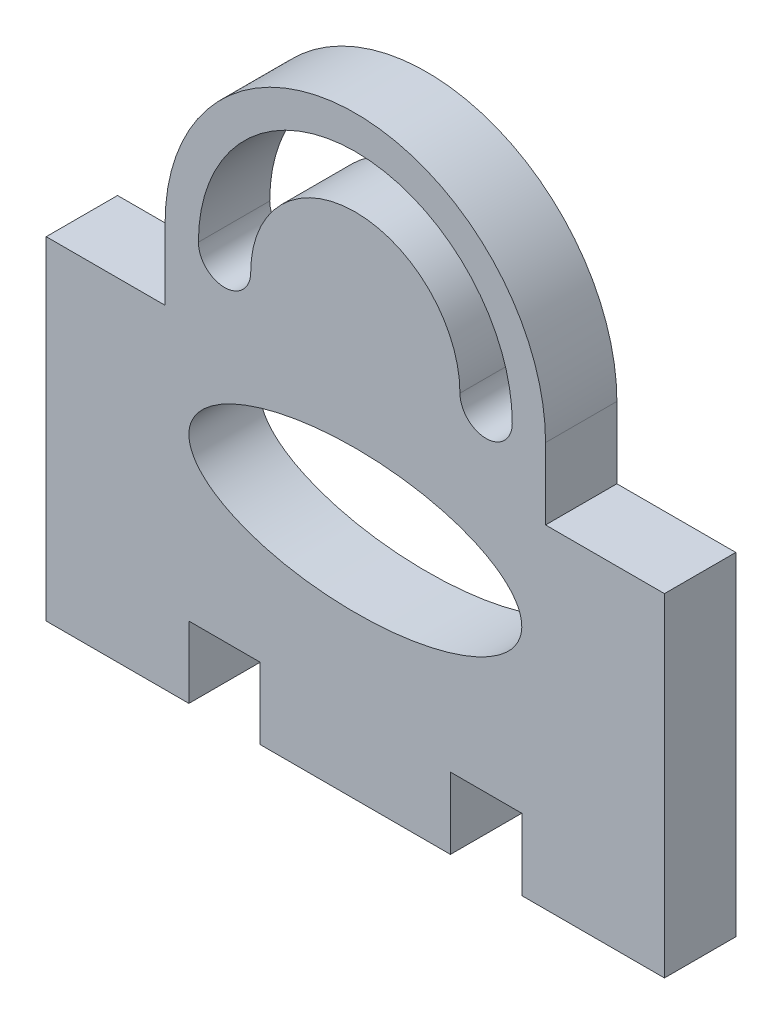
ISO-10303-21;
HEADER;
FILE_DESCRIPTION(('STEP AP214'),'2;1');
FILE_NAME('part.step','',(''),(''),'','','');
FILE_SCHEMA(('AUTOMOTIVE_DESIGN { 1 0 10303 214 1 1 1 1 }'));
ENDSEC;
DATA;
#1=APPLICATION_CONTEXT('core data for automotive mechanical design processes');
#2=APPLICATION_PROTOCOL_DEFINITION('international standard','automotive_design',2000,#1);
#3=PRODUCT_CONTEXT('',#1,'mechanical');
#4=PRODUCT('Part','Part','',(#3));
#5=PRODUCT_RELATED_PRODUCT_CATEGORY('part','',(#4));
#6=PRODUCT_DEFINITION_FORMATION('','',#4);
#7=PRODUCT_DEFINITION_CONTEXT('part definition',#1,'design');
#8=PRODUCT_DEFINITION('design','',#6,#7);
#9=PRODUCT_DEFINITION_SHAPE('','',#8);
#10=(LENGTH_UNIT() NAMED_UNIT(*) SI_UNIT(.MILLI.,.METRE.));
#11=(NAMED_UNIT(*) PLANE_ANGLE_UNIT() SI_UNIT($,.RADIAN.));
#12=(NAMED_UNIT(*) SI_UNIT($,.STERADIAN.) SOLID_ANGLE_UNIT());
#13=UNCERTAINTY_MEASURE_WITH_UNIT(LENGTH_MEASURE(1.E-05),#10,'distance_accuracy_value','');
#14=(GEOMETRIC_REPRESENTATION_CONTEXT(3) GLOBAL_UNCERTAINTY_ASSIGNED_CONTEXT((#13)) GLOBAL_UNIT_ASSIGNED_CONTEXT((#10,
#11,#12)) REPRESENTATION_CONTEXT('',''));
#15=CARTESIAN_POINT('',(0.,0.,0.));
#16=DIRECTION('',(0.,0.,1.));
#17=DIRECTION('',(1.,0.,0.));
#18=AXIS2_PLACEMENT_3D('',#15,#16,#17);
#19=CARTESIAN_POINT('',(0.,100.,30.));
#20=DIRECTION('',(0.,0.,1.));
#21=DIRECTION('',(1.,0.,0.));
#22=AXIS2_PLACEMENT_3D('',#19,#20,#21);
#23=PLANE('',#22);
#24=CARTESIAN_POINT('',(0.,100.,30.));
#25=DIRECTION('',(0.,0.,1.));
#26=DIRECTION('',(1.,0.,0.));
#27=AXIS2_PLACEMENT_3D('',#24,#25,#26);
#28=CIRCLE('',#27,66.);
#29=CARTESIAN_POINT('',(66.,100.,30.));
#30=VERTEX_POINT('',#29);
#31=CARTESIAN_POINT('',(-66.,100.,30.));
#32=VERTEX_POINT('',#31);
#33=EDGE_CURVE('E178',#30,#32,#28,.T.);
#34=ORIENTED_EDGE('',*,*,#33,.F.);
#35=CARTESIAN_POINT('',(55.,100.,30.));
#36=DIRECTION('',(0.,0.,1.));
#37=DIRECTION('',(1.,0.,0.));
#38=AXIS2_PLACEMENT_3D('',#35,#36,#37);
#39=CIRCLE('',#38,11.);
#40=CARTESIAN_POINT('',(44.,100.,30.));
#41=VERTEX_POINT('',#40);
#42=EDGE_CURVE('E170',#41,#30,#39,.T.);
#43=ORIENTED_EDGE('',*,*,#42,.F.);
#44=CARTESIAN_POINT('',(0.,100.,30.));
#45=DIRECTION('',(0.,0.,-1.));
#46=DIRECTION('',(1.,0.,0.));
#47=AXIS2_PLACEMENT_3D('',#44,#45,#46);
#48=CIRCLE('',#47,44.);
#49=CARTESIAN_POINT('',(-44.,100.,30.));
#50=VERTEX_POINT('',#49);
#51=EDGE_CURVE('E193',#50,#41,#48,.T.);
#52=ORIENTED_EDGE('',*,*,#51,.F.);
#53=CARTESIAN_POINT('',(-55.,100.,30.));
#54=DIRECTION('',(0.,0.,1.));
#55=DIRECTION('',(1.,0.,0.));
#56=AXIS2_PLACEMENT_3D('',#53,#54,#55);
#57=CIRCLE('',#56,11.);
#58=EDGE_CURVE('E191',#32,#50,#57,.T.);
#59=ORIENTED_EDGE('',*,*,#58,.F.);
#60=EDGE_LOOP('',(#34,#43,#52,#59));
#61=FACE_BOUND('',#60,.T.);
#62=DIRECTION('',(-1.,0.,0.));
#63=VECTOR('',#62,1.);
#64=CARTESIAN_POINT('',(-80.,70.,30.));
#65=LINE('',#64,#63);
#66=CARTESIAN_POINT('',(-80.,70.,30.));
#67=VERTEX_POINT('',#66);
#68=CARTESIAN_POINT('',(-130.,70.,30.));
#69=VERTEX_POINT('',#68);
#70=EDGE_CURVE('E209',#67,#69,#65,.T.);
#71=ORIENTED_EDGE('',*,*,#70,.T.);
#72=DIRECTION('',(0.,-1.,0.));
#73=VECTOR('',#72,1.);
#74=CARTESIAN_POINT('',(-130.,-70.,30.));
#75=LINE('',#74,#73);
#76=CARTESIAN_POINT('',(-130.,-70.,30.));
#77=VERTEX_POINT('',#76);
#78=EDGE_CURVE('E212',#69,#77,#75,.T.);
#79=ORIENTED_EDGE('',*,*,#78,.T.);
#80=DIRECTION('',(1.,0.,0.));
#81=VECTOR('',#80,1.);
#82=CARTESIAN_POINT('',(-130.,-70.,30.));
#83=LINE('',#82,#81);
#84=CARTESIAN_POINT('',(-70.,-70.,30.));
#85=VERTEX_POINT('',#84);
#86=EDGE_CURVE('E215',#77,#85,#83,.T.);
#87=ORIENTED_EDGE('',*,*,#86,.T.);
#88=DIRECTION('',(0.,1.,0.));
#89=VECTOR('',#88,1.);
#90=CARTESIAN_POINT('',(-70.,-70.,30.));
#91=LINE('',#90,#89);
#92=CARTESIAN_POINT('',(-70.,-40.,30.));
#93=VERTEX_POINT('',#92);
#94=EDGE_CURVE('E217',#85,#93,#91,.T.);
#95=ORIENTED_EDGE('',*,*,#94,.T.);
#96=DIRECTION('',(1.,0.,0.));
#97=VECTOR('',#96,1.);
#98=CARTESIAN_POINT('',(-40.,-40.,30.));
#99=LINE('',#98,#97);
#100=CARTESIAN_POINT('',(-40.,-40.,30.));
#101=VERTEX_POINT('',#100);
#102=EDGE_CURVE('E219',#93,#101,#99,.T.);
#103=ORIENTED_EDGE('',*,*,#102,.T.);
#104=DIRECTION('',(0.,-1.,0.));
#105=VECTOR('',#104,1.);
#106=CARTESIAN_POINT('',(-40.,-70.,30.));
#107=LINE('',#106,#105);
#108=CARTESIAN_POINT('',(-40.,-70.,30.));
#109=VERTEX_POINT('',#108);
#110=EDGE_CURVE('E221',#101,#109,#107,.T.);
#111=ORIENTED_EDGE('',*,*,#110,.T.);
#112=DIRECTION('',(1.,0.,0.));
#113=VECTOR('',#112,1.);
#114=CARTESIAN_POINT('',(40.,-70.,30.));
#115=LINE('',#114,#113);
#116=CARTESIAN_POINT('',(40.,-70.,30.));
#117=VERTEX_POINT('',#116);
#118=EDGE_CURVE('E223',#109,#117,#115,.T.);
#119=ORIENTED_EDGE('',*,*,#118,.T.);
#120=DIRECTION('',(0.,1.,0.));
#121=VECTOR('',#120,1.);
#122=CARTESIAN_POINT('',(40.,-40.,30.));
#123=LINE('',#122,#121);
#124=CARTESIAN_POINT('',(40.,-40.,30.));
#125=VERTEX_POINT('',#124);
#126=EDGE_CURVE('E225',#117,#125,#123,.T.);
#127=ORIENTED_EDGE('',*,*,#126,.T.);
#128=DIRECTION('',(1.,0.,0.));
#129=VECTOR('',#128,1.);
#130=CARTESIAN_POINT('',(70.,-40.,30.));
#131=LINE('',#130,#129);
#132=CARTESIAN_POINT('',(70.,-40.,30.));
#133=VERTEX_POINT('',#132);
#134=EDGE_CURVE('E227',#125,#133,#131,.T.);
#135=ORIENTED_EDGE('',*,*,#134,.T.);
#136=DIRECTION('',(0.,-1.,0.));
#137=VECTOR('',#136,1.);
#138=CARTESIAN_POINT('',(70.,-40.,30.));
#139=LINE('',#138,#137);
#140=CARTESIAN_POINT('',(70.,-70.,30.));
#141=VERTEX_POINT('',#140);
#142=EDGE_CURVE('E229',#133,#141,#139,.T.);
#143=ORIENTED_EDGE('',*,*,#142,.T.);
#144=DIRECTION('',(1.,0.,0.));
#145=VECTOR('',#144,1.);
#146=CARTESIAN_POINT('',(130.,-70.,30.));
#147=LINE('',#146,#145);
#148=CARTESIAN_POINT('',(130.,-70.,30.));
#149=VERTEX_POINT('',#148);
#150=EDGE_CURVE('E231',#141,#149,#147,.T.);
#151=ORIENTED_EDGE('',*,*,#150,.T.);
#152=DIRECTION('',(0.,1.,0.));
#153=VECTOR('',#152,1.);
#154=CARTESIAN_POINT('',(130.,-70.,30.));
#155=LINE('',#154,#153);
#156=CARTESIAN_POINT('',(130.,70.,30.));
#157=VERTEX_POINT('',#156);
#158=EDGE_CURVE('E233',#149,#157,#155,.T.);
#159=ORIENTED_EDGE('',*,*,#158,.T.);
#160=DIRECTION('',(-1.,0.,0.));
#161=VECTOR('',#160,1.);
#162=CARTESIAN_POINT('',(130.,70.,30.));
#163=LINE('',#162,#161);
#164=CARTESIAN_POINT('',(80.,70.,30.));
#165=VERTEX_POINT('',#164);
#166=EDGE_CURVE('E235',#157,#165,#163,.T.);
#167=ORIENTED_EDGE('',*,*,#166,.T.);
#168=DIRECTION('',(0.,1.,0.));
#169=VECTOR('',#168,1.);
#170=CARTESIAN_POINT('',(80.,100.,30.));
#171=LINE('',#170,#169);
#172=CARTESIAN_POINT('',(80.,100.,30.));
#173=VERTEX_POINT('',#172);
#174=EDGE_CURVE('E237',#165,#173,#171,.T.);
#175=ORIENTED_EDGE('',*,*,#174,.T.);
#176=CARTESIAN_POINT('',(0.,100.,30.));
#177=DIRECTION('',(0.,0.,1.));
#178=DIRECTION('',(1.,0.,0.));
#179=AXIS2_PLACEMENT_3D('',#176,#177,#178);
#180=CIRCLE('',#179,80.);
#181=CARTESIAN_POINT('',(-80.,100.,30.));
#182=VERTEX_POINT('',#181);
#183=EDGE_CURVE('E239',#173,#182,#180,.T.);
#184=ORIENTED_EDGE('',*,*,#183,.T.);
#185=DIRECTION('',(0.,-1.,0.));
#186=VECTOR('',#185,1.);
#187=CARTESIAN_POINT('',(-80.,100.,30.));
#188=LINE('',#187,#186);
#189=EDGE_CURVE('E241',#182,#67,#188,.T.);
#190=ORIENTED_EDGE('',*,*,#189,.T.);
#191=EDGE_LOOP('',(#71,#79,#87,#95,#103,#111,#119,#127,#135,#143,#151,#159,#167,#175,#184,#190));
#192=FACE_BOUND('',#191,.T.);
#193=CARTESIAN_POINT('',(0.,28.0052739258551,30.));
#194=DIRECTION('',(0.,0.,1.));
#195=DIRECTION('',(-1.,0.,0.));
#196=AXIS2_PLACEMENT_3D('',#193,#194,#195);
#197=ELLIPSE('',#196,70.,30.);
#198=CARTESIAN_POINT('',(-70.,28.0052739258551,30.));
#199=VERTEX_POINT('',#198);
#200=EDGE_CURVE('E199',#199,#199,#197,.T.);
#201=ORIENTED_EDGE('',*,*,#200,.F.);
#202=EDGE_LOOP('',(#201));
#203=FACE_BOUND('',#202,.T.);
#204=ADVANCED_FACE('F33',(#61,#192,#203),#23,.T.);
#205=CARTESIAN_POINT('',(0.,100.,0.));
#206=DIRECTION('',(0.,0.,1.));
#207=DIRECTION('',(1.,0.,0.));
#208=AXIS2_PLACEMENT_3D('',#205,#206,#207);
#209=PLANE('',#208);
#210=DIRECTION('',(-1.,0.,0.));
#211=VECTOR('',#210,1.);
#212=CARTESIAN_POINT('',(-80.,70.,0.));
#213=LINE('',#212,#211);
#214=CARTESIAN_POINT('',(-80.,70.,0.));
#215=VERTEX_POINT('',#214);
#216=CARTESIAN_POINT('',(-130.,70.,0.));
#217=VERTEX_POINT('',#216);
#218=EDGE_CURVE('E186',#215,#217,#213,.T.);
#219=ORIENTED_EDGE('',*,*,#218,.F.);
#220=DIRECTION('',(0.,-1.,0.));
#221=VECTOR('',#220,1.);
#222=CARTESIAN_POINT('',(-80.,100.,0.));
#223=LINE('',#222,#221);
#224=CARTESIAN_POINT('',(-80.,100.,0.));
#225=VERTEX_POINT('',#224);
#226=EDGE_CURVE('E213',#225,#215,#223,.T.);
#227=ORIENTED_EDGE('',*,*,#226,.F.);
#228=CARTESIAN_POINT('',(0.,100.,0.));
#229=DIRECTION('',(0.,0.,1.));
#230=DIRECTION('',(1.,0.,0.));
#231=AXIS2_PLACEMENT_3D('',#228,#229,#230);
#232=CIRCLE('',#231,80.);
#233=CARTESIAN_POINT('',(80.,100.,0.));
#234=VERTEX_POINT('',#233);
#235=EDGE_CURVE('E272',#234,#225,#232,.T.);
#236=ORIENTED_EDGE('',*,*,#235,.F.);
#237=DIRECTION('',(0.,1.,0.));
#238=VECTOR('',#237,1.);
#239=CARTESIAN_POINT('',(80.,100.,0.));
#240=LINE('',#239,#238);
#241=CARTESIAN_POINT('',(80.,70.,0.));
#242=VERTEX_POINT('',#241);
#243=EDGE_CURVE('E270',#242,#234,#240,.T.);
#244=ORIENTED_EDGE('',*,*,#243,.F.);
#245=DIRECTION('',(-1.,0.,0.));
#246=VECTOR('',#245,1.);
#247=CARTESIAN_POINT('',(130.,70.,0.));
#248=LINE('',#247,#246);
#249=CARTESIAN_POINT('',(130.,70.,0.));
#250=VERTEX_POINT('',#249);
#251=EDGE_CURVE('E268',#250,#242,#248,.T.);
#252=ORIENTED_EDGE('',*,*,#251,.F.);
#253=DIRECTION('',(0.,1.,0.));
#254=VECTOR('',#253,1.);
#255=CARTESIAN_POINT('',(130.,-70.,0.));
#256=LINE('',#255,#254);
#257=CARTESIAN_POINT('',(130.,-70.,0.));
#258=VERTEX_POINT('',#257);
#259=EDGE_CURVE('E266',#258,#250,#256,.T.);
#260=ORIENTED_EDGE('',*,*,#259,.F.);
#261=DIRECTION('',(1.,0.,0.));
#262=VECTOR('',#261,1.);
#263=CARTESIAN_POINT('',(130.,-70.,0.));
#264=LINE('',#263,#262);
#265=CARTESIAN_POINT('',(70.,-70.,0.));
#266=VERTEX_POINT('',#265);
#267=EDGE_CURVE('E264',#266,#258,#264,.T.);
#268=ORIENTED_EDGE('',*,*,#267,.F.);
#269=DIRECTION('',(0.,-1.,0.));
#270=VECTOR('',#269,1.);
#271=CARTESIAN_POINT('',(70.,-40.,0.));
#272=LINE('',#271,#270);
#273=CARTESIAN_POINT('',(70.,-40.,0.));
#274=VERTEX_POINT('',#273);
#275=EDGE_CURVE('E262',#274,#266,#272,.T.);
#276=ORIENTED_EDGE('',*,*,#275,.F.);
#277=DIRECTION('',(1.,0.,0.));
#278=VECTOR('',#277,1.);
#279=CARTESIAN_POINT('',(70.,-40.,0.));
#280=LINE('',#279,#278);
#281=CARTESIAN_POINT('',(40.,-40.,0.));
#282=VERTEX_POINT('',#281);
#283=EDGE_CURVE('E260',#282,#274,#280,.T.);
#284=ORIENTED_EDGE('',*,*,#283,.F.);
#285=DIRECTION('',(0.,1.,0.));
#286=VECTOR('',#285,1.);
#287=CARTESIAN_POINT('',(40.,-40.,0.));
#288=LINE('',#287,#286);
#289=CARTESIAN_POINT('',(40.,-70.,0.));
#290=VERTEX_POINT('',#289);
#291=EDGE_CURVE('E258',#290,#282,#288,.T.);
#292=ORIENTED_EDGE('',*,*,#291,.F.);
#293=DIRECTION('',(1.,0.,0.));
#294=VECTOR('',#293,1.);
#295=CARTESIAN_POINT('',(40.,-70.,0.));
#296=LINE('',#295,#294);
#297=CARTESIAN_POINT('',(-40.,-70.,0.));
#298=VERTEX_POINT('',#297);
#299=EDGE_CURVE('E256',#298,#290,#296,.T.);
#300=ORIENTED_EDGE('',*,*,#299,.F.);
#301=DIRECTION('',(0.,-1.,0.));
#302=VECTOR('',#301,1.);
#303=CARTESIAN_POINT('',(-40.,-70.,0.));
#304=LINE('',#303,#302);
#305=CARTESIAN_POINT('',(-40.,-40.,0.));
#306=VERTEX_POINT('',#305);
#307=EDGE_CURVE('E254',#306,#298,#304,.T.);
#308=ORIENTED_EDGE('',*,*,#307,.F.);
#309=DIRECTION('',(1.,0.,0.));
#310=VECTOR('',#309,1.);
#311=CARTESIAN_POINT('',(-40.,-40.,0.));
#312=LINE('',#311,#310);
#313=CARTESIAN_POINT('',(-70.,-40.,0.));
#314=VERTEX_POINT('',#313);
#315=EDGE_CURVE('E252',#314,#306,#312,.T.);
#316=ORIENTED_EDGE('',*,*,#315,.F.);
#317=DIRECTION('',(0.,1.,0.));
#318=VECTOR('',#317,1.);
#319=CARTESIAN_POINT('',(-70.,-70.,0.));
#320=LINE('',#319,#318);
#321=CARTESIAN_POINT('',(-70.,-70.,0.));
#322=VERTEX_POINT('',#321);
#323=EDGE_CURVE('E250',#322,#314,#320,.T.);
#324=ORIENTED_EDGE('',*,*,#323,.F.);
#325=DIRECTION('',(1.,0.,0.));
#326=VECTOR('',#325,1.);
#327=CARTESIAN_POINT('',(-130.,-70.,0.));
#328=LINE('',#327,#326);
#329=CARTESIAN_POINT('',(-130.,-70.,0.));
#330=VERTEX_POINT('',#329);
#331=EDGE_CURVE('E248',#330,#322,#328,.T.);
#332=ORIENTED_EDGE('',*,*,#331,.F.);
#333=DIRECTION('',(0.,-1.,0.));
#334=VECTOR('',#333,1.);
#335=CARTESIAN_POINT('',(-130.,-70.,0.));
#336=LINE('',#335,#334);
#337=EDGE_CURVE('E246',#217,#330,#336,.T.);
#338=ORIENTED_EDGE('',*,*,#337,.F.);
#339=EDGE_LOOP('',(#219,#227,#236,#244,#252,#260,#268,#276,#284,#292,#300,#308,#316,#324,#332,#338));
#340=FACE_BOUND('',#339,.T.);
#341=CARTESIAN_POINT('',(55.,100.,0.));
#342=DIRECTION('',(0.,0.,1.));
#343=DIRECTION('',(1.,0.,0.));
#344=AXIS2_PLACEMENT_3D('',#341,#342,#343);
#345=CIRCLE('',#344,11.);
#346=CARTESIAN_POINT('',(44.,100.,0.));
#347=VERTEX_POINT('',#346);
#348=CARTESIAN_POINT('',(66.,100.,0.));
#349=VERTEX_POINT('',#348);
#350=EDGE_CURVE('E56',#347,#349,#345,.T.);
#351=ORIENTED_EDGE('',*,*,#350,.T.);
#352=CARTESIAN_POINT('',(0.,100.,0.));
#353=DIRECTION('',(0.,0.,1.));
#354=DIRECTION('',(1.,0.,0.));
#355=AXIS2_PLACEMENT_3D('',#352,#353,#354);
#356=CIRCLE('',#355,66.);
#357=CARTESIAN_POINT('',(-66.,100.,0.));
#358=VERTEX_POINT('',#357);
#359=EDGE_CURVE('E185',#349,#358,#356,.T.);
#360=ORIENTED_EDGE('',*,*,#359,.T.);
#361=CARTESIAN_POINT('',(-55.,100.,0.));
#362=DIRECTION('',(0.,0.,1.));
#363=DIRECTION('',(1.,0.,0.));
#364=AXIS2_PLACEMENT_3D('',#361,#362,#363);
#365=CIRCLE('',#364,11.);
#366=CARTESIAN_POINT('',(-44.,100.,0.));
#367=VERTEX_POINT('',#366);
#368=EDGE_CURVE('E201',#358,#367,#365,.T.);
#369=ORIENTED_EDGE('',*,*,#368,.T.);
#370=CARTESIAN_POINT('',(0.,100.,0.));
#371=DIRECTION('',(0.,0.,-1.));
#372=DIRECTION('',(1.,0.,0.));
#373=AXIS2_PLACEMENT_3D('',#370,#371,#372);
#374=CIRCLE('',#373,44.);
#375=EDGE_CURVE('E179',#367,#347,#374,.T.);
#376=ORIENTED_EDGE('',*,*,#375,.T.);
#377=EDGE_LOOP('',(#351,#360,#369,#376));
#378=FACE_BOUND('',#377,.T.);
#379=CARTESIAN_POINT('',(0.,28.0052739258551,0.));
#380=DIRECTION('',(0.,0.,1.));
#381=DIRECTION('',(-1.,0.,0.));
#382=AXIS2_PLACEMENT_3D('',#379,#380,#381);
#383=ELLIPSE('',#382,70.,30.);
#384=CARTESIAN_POINT('',(-70.,28.0052739258551,0.));
#385=VERTEX_POINT('',#384);
#386=EDGE_CURVE('E588',#385,#385,#383,.T.);
#387=ORIENTED_EDGE('',*,*,#386,.T.);
#388=EDGE_LOOP('',(#387));
#389=FACE_BOUND('',#388,.T.);
#390=ADVANCED_FACE('F326',(#340,#378,#389),#209,.F.);
#391=CARTESIAN_POINT('',(-80.,70.,30.));
#392=DIRECTION('',(0.,-1.,0.));
#393=DIRECTION('',(1.,0.,0.));
#394=AXIS2_PLACEMENT_3D('',#391,#392,#393);
#395=PLANE('',#394);
#396=ORIENTED_EDGE('',*,*,#218,.T.);
#397=DIRECTION('',(0.,0.,-1.));
#398=VECTOR('',#397,1.);
#399=CARTESIAN_POINT('',(-130.,70.,30.));
#400=LINE('',#399,#398);
#401=EDGE_CURVE('E11',#69,#217,#400,.T.);
#402=ORIENTED_EDGE('',*,*,#401,.F.);
#403=ORIENTED_EDGE('',*,*,#70,.F.);
#404=DIRECTION('',(0.,0.,-1.));
#405=VECTOR('',#404,1.);
#406=CARTESIAN_POINT('',(-80.,70.,30.));
#407=LINE('',#406,#405);
#408=EDGE_CURVE('E243',#67,#215,#407,.T.);
#409=ORIENTED_EDGE('',*,*,#408,.T.);
#410=EDGE_LOOP('',(#396,#402,#403,#409));
#411=FACE_BOUND('',#410,.T.);
#412=ADVANCED_FACE('F35',(#411),#395,.F.);
#413=CARTESIAN_POINT('',(-130.,-70.,30.));
#414=DIRECTION('',(1.,0.,0.));
#415=DIRECTION('',(0.,0.,-1.));
#416=AXIS2_PLACEMENT_3D('',#413,#414,#415);
#417=PLANE('',#416);
#418=ORIENTED_EDGE('',*,*,#337,.T.);
#419=DIRECTION('',(0.,0.,-1.));
#420=VECTOR('',#419,1.);
#421=CARTESIAN_POINT('',(-130.,-70.,30.));
#422=LINE('',#421,#420);
#423=EDGE_CURVE('E41',#77,#330,#422,.T.);
#424=ORIENTED_EDGE('',*,*,#423,.F.);
#425=ORIENTED_EDGE('',*,*,#78,.F.);
#426=ORIENTED_EDGE('',*,*,#401,.T.);
#427=EDGE_LOOP('',(#418,#424,#425,#426));
#428=FACE_BOUND('',#427,.T.);
#429=ADVANCED_FACE('F343',(#428),#417,.F.);
#430=CARTESIAN_POINT('',(-130.,-70.,30.));
#431=DIRECTION('',(0.,1.,0.));
#432=DIRECTION('',(-1.,0.,0.));
#433=AXIS2_PLACEMENT_3D('',#430,#431,#432);
#434=PLANE('',#433);
#435=ORIENTED_EDGE('',*,*,#331,.T.);
#436=DIRECTION('',(0.,0.,-1.));
#437=VECTOR('',#436,1.);
#438=CARTESIAN_POINT('',(-70.,-70.,30.));
#439=LINE('',#438,#437);
#440=EDGE_CURVE('E313',#85,#322,#439,.T.);
#441=ORIENTED_EDGE('',*,*,#440,.F.);
#442=ORIENTED_EDGE('',*,*,#86,.F.);
#443=ORIENTED_EDGE('',*,*,#423,.T.);
#444=EDGE_LOOP('',(#435,#441,#442,#443));
#445=FACE_BOUND('',#444,.T.);
#446=ADVANCED_FACE('F320',(#445),#434,.F.);
#447=CARTESIAN_POINT('',(-70.,-70.,30.));
#448=DIRECTION('',(-1.,0.,0.));
#449=DIRECTION('',(0.,0.,1.));
#450=AXIS2_PLACEMENT_3D('',#447,#448,#449);
#451=PLANE('',#450);
#452=ORIENTED_EDGE('',*,*,#323,.T.);
#453=DIRECTION('',(0.,0.,-1.));
#454=VECTOR('',#453,1.);
#455=CARTESIAN_POINT('',(-70.,-40.,30.));
#456=LINE('',#455,#454);
#457=EDGE_CURVE('E310',#93,#314,#456,.T.);
#458=ORIENTED_EDGE('',*,*,#457,.F.);
#459=ORIENTED_EDGE('',*,*,#94,.F.);
#460=ORIENTED_EDGE('',*,*,#440,.T.);
#461=EDGE_LOOP('',(#452,#458,#459,#460));
#462=FACE_BOUND('',#461,.T.);
#463=ADVANCED_FACE('F332',(#462),#451,.F.);
#464=CARTESIAN_POINT('',(-40.,-40.,30.));
#465=DIRECTION('',(0.,1.,0.));
#466=DIRECTION('',(0.,0.,1.));
#467=AXIS2_PLACEMENT_3D('',#464,#465,#466);
#468=PLANE('',#467);
#469=ORIENTED_EDGE('',*,*,#315,.T.);
#470=DIRECTION('',(0.,0.,-1.));
#471=VECTOR('',#470,1.);
#472=CARTESIAN_POINT('',(-40.,-40.,30.));
#473=LINE('',#472,#471);
#474=EDGE_CURVE('E307',#101,#306,#473,.T.);
#475=ORIENTED_EDGE('',*,*,#474,.F.);
#476=ORIENTED_EDGE('',*,*,#102,.F.);
#477=ORIENTED_EDGE('',*,*,#457,.T.);
#478=EDGE_LOOP('',(#469,#475,#476,#477));
#479=FACE_BOUND('',#478,.T.);
#480=ADVANCED_FACE('F336',(#479),#468,.F.);
#481=CARTESIAN_POINT('',(-40.,-70.,30.));
#482=DIRECTION('',(1.,0.,0.));
#483=DIRECTION('',(0.,0.,-1.));
#484=AXIS2_PLACEMENT_3D('',#481,#482,#483);
#485=PLANE('',#484);
#486=ORIENTED_EDGE('',*,*,#307,.T.);
#487=DIRECTION('',(0.,0.,-1.));
#488=VECTOR('',#487,1.);
#489=CARTESIAN_POINT('',(-40.,-70.,30.));
#490=LINE('',#489,#488);
#491=EDGE_CURVE('E304',#109,#298,#490,.T.);
#492=ORIENTED_EDGE('',*,*,#491,.F.);
#493=ORIENTED_EDGE('',*,*,#110,.F.);
#494=ORIENTED_EDGE('',*,*,#474,.T.);
#495=EDGE_LOOP('',(#486,#492,#493,#494));
#496=FACE_BOUND('',#495,.T.);
#497=ADVANCED_FACE('F396',(#496),#485,.F.);
#498=CARTESIAN_POINT('',(40.,-70.,30.));
#499=DIRECTION('',(0.,1.,0.));
#500=DIRECTION('',(0.,0.,1.));
#501=AXIS2_PLACEMENT_3D('',#498,#499,#500);
#502=PLANE('',#501);
#503=ORIENTED_EDGE('',*,*,#299,.T.);
#504=DIRECTION('',(0.,0.,-1.));
#505=VECTOR('',#504,1.);
#506=CARTESIAN_POINT('',(40.,-70.,30.));
#507=LINE('',#506,#505);
#508=EDGE_CURVE('E301',#117,#290,#507,.T.);
#509=ORIENTED_EDGE('',*,*,#508,.F.);
#510=ORIENTED_EDGE('',*,*,#118,.F.);
#511=ORIENTED_EDGE('',*,*,#491,.T.);
#512=EDGE_LOOP('',(#503,#509,#510,#511));
#513=FACE_BOUND('',#512,.T.);
#514=ADVANCED_FACE('F393',(#513),#502,.F.);
#515=CARTESIAN_POINT('',(40.,-40.,30.));
#516=DIRECTION('',(-1.,0.,0.));
#517=DIRECTION('',(0.,0.,1.));
#518=AXIS2_PLACEMENT_3D('',#515,#516,#517);
#519=PLANE('',#518);
#520=ORIENTED_EDGE('',*,*,#291,.T.);
#521=DIRECTION('',(0.,0.,-1.));
#522=VECTOR('',#521,1.);
#523=CARTESIAN_POINT('',(40.,-40.,30.));
#524=LINE('',#523,#522);
#525=EDGE_CURVE('E298',#125,#282,#524,.T.);
#526=ORIENTED_EDGE('',*,*,#525,.F.);
#527=ORIENTED_EDGE('',*,*,#126,.F.);
#528=ORIENTED_EDGE('',*,*,#508,.T.);
#529=EDGE_LOOP('',(#520,#526,#527,#528));
#530=FACE_BOUND('',#529,.T.);
#531=ADVANCED_FACE('F389',(#530),#519,.F.);
#532=CARTESIAN_POINT('',(70.,-40.,30.));
#533=DIRECTION('',(0.,1.,0.));
#534=DIRECTION('',(0.,0.,1.));
#535=AXIS2_PLACEMENT_3D('',#532,#533,#534);
#536=PLANE('',#535);
#537=ORIENTED_EDGE('',*,*,#283,.T.);
#538=DIRECTION('',(0.,0.,-1.));
#539=VECTOR('',#538,1.);
#540=CARTESIAN_POINT('',(70.,-40.,30.));
#541=LINE('',#540,#539);
#542=EDGE_CURVE('E295',#133,#274,#541,.T.);
#543=ORIENTED_EDGE('',*,*,#542,.F.);
#544=ORIENTED_EDGE('',*,*,#134,.F.);
#545=ORIENTED_EDGE('',*,*,#525,.T.);
#546=EDGE_LOOP('',(#537,#543,#544,#545));
#547=FACE_BOUND('',#546,.T.);
#548=ADVANCED_FACE('F385',(#547),#536,.F.);
#549=CARTESIAN_POINT('',(70.,-40.,30.));
#550=DIRECTION('',(1.,0.,0.));
#551=DIRECTION('',(0.,0.,-1.));
#552=AXIS2_PLACEMENT_3D('',#549,#550,#551);
#553=PLANE('',#552);
#554=ORIENTED_EDGE('',*,*,#275,.T.);
#555=DIRECTION('',(0.,0.,-1.));
#556=VECTOR('',#555,1.);
#557=CARTESIAN_POINT('',(70.,-70.,30.));
#558=LINE('',#557,#556);
#559=EDGE_CURVE('E292',#141,#266,#558,.T.);
#560=ORIENTED_EDGE('',*,*,#559,.F.);
#561=ORIENTED_EDGE('',*,*,#142,.F.);
#562=ORIENTED_EDGE('',*,*,#542,.T.);
#563=EDGE_LOOP('',(#554,#560,#561,#562));
#564=FACE_BOUND('',#563,.T.);
#565=ADVANCED_FACE('F380',(#564),#553,.F.);
#566=CARTESIAN_POINT('',(130.,-70.,30.));
#567=DIRECTION('',(0.,1.,0.));
#568=DIRECTION('',(-1.,0.,0.));
#569=AXIS2_PLACEMENT_3D('',#566,#567,#568);
#570=PLANE('',#569);
#571=ORIENTED_EDGE('',*,*,#267,.T.);
#572=DIRECTION('',(0.,0.,-1.));
#573=VECTOR('',#572,1.);
#574=CARTESIAN_POINT('',(130.,-70.,30.));
#575=LINE('',#574,#573);
#576=EDGE_CURVE('E289',#149,#258,#575,.T.);
#577=ORIENTED_EDGE('',*,*,#576,.F.);
#578=ORIENTED_EDGE('',*,*,#150,.F.);
#579=ORIENTED_EDGE('',*,*,#559,.T.);
#580=EDGE_LOOP('',(#571,#577,#578,#579));
#581=FACE_BOUND('',#580,.T.);
#582=ADVANCED_FACE('F374',(#581),#570,.F.);
#583=CARTESIAN_POINT('',(130.,-70.,30.));
#584=DIRECTION('',(-1.,0.,0.));
#585=DIRECTION('',(0.,0.,1.));
#586=AXIS2_PLACEMENT_3D('',#583,#584,#585);
#587=PLANE('',#586);
#588=ORIENTED_EDGE('',*,*,#259,.T.);
#589=DIRECTION('',(0.,0.,-1.));
#590=VECTOR('',#589,1.);
#591=CARTESIAN_POINT('',(130.,70.,30.));
#592=LINE('',#591,#590);
#593=EDGE_CURVE('E286',#157,#250,#592,.T.);
#594=ORIENTED_EDGE('',*,*,#593,.F.);
#595=ORIENTED_EDGE('',*,*,#158,.F.);
#596=ORIENTED_EDGE('',*,*,#576,.T.);
#597=EDGE_LOOP('',(#588,#594,#595,#596));
#598=FACE_BOUND('',#597,.T.);
#599=ADVANCED_FACE('F370',(#598),#587,.F.);
#600=CARTESIAN_POINT('',(130.,70.,30.));
#601=DIRECTION('',(0.,-1.,0.));
#602=DIRECTION('',(1.,0.,0.));
#603=AXIS2_PLACEMENT_3D('',#600,#601,#602);
#604=PLANE('',#603);
#605=ORIENTED_EDGE('',*,*,#251,.T.);
#606=DIRECTION('',(0.,0.,-1.));
#607=VECTOR('',#606,1.);
#608=CARTESIAN_POINT('',(80.,70.,30.));
#609=LINE('',#608,#607);
#610=EDGE_CURVE('E283',#165,#242,#609,.T.);
#611=ORIENTED_EDGE('',*,*,#610,.F.);
#612=ORIENTED_EDGE('',*,*,#166,.F.);
#613=ORIENTED_EDGE('',*,*,#593,.T.);
#614=EDGE_LOOP('',(#605,#611,#612,#613));
#615=FACE_BOUND('',#614,.T.);
#616=ADVANCED_FACE('F365',(#615),#604,.F.);
#617=CARTESIAN_POINT('',(80.,100.,30.));
#618=DIRECTION('',(-1.,0.,0.));
#619=DIRECTION('',(0.,0.,1.));
#620=AXIS2_PLACEMENT_3D('',#617,#618,#619);
#621=PLANE('',#620);
#622=ORIENTED_EDGE('',*,*,#243,.T.);
#623=DIRECTION('',(0.,0.,-1.));
#624=VECTOR('',#623,1.);
#625=CARTESIAN_POINT('',(80.,100.,30.));
#626=LINE('',#625,#624);
#627=EDGE_CURVE('E280',#173,#234,#626,.T.);
#628=ORIENTED_EDGE('',*,*,#627,.F.);
#629=ORIENTED_EDGE('',*,*,#174,.F.);
#630=ORIENTED_EDGE('',*,*,#610,.T.);
#631=EDGE_LOOP('',(#622,#628,#629,#630));
#632=FACE_BOUND('',#631,.T.);
#633=ADVANCED_FACE('F359',(#632),#621,.F.);
#634=CARTESIAN_POINT('',(0.,100.,30.));
#635=DIRECTION('',(0.,0.,-1.));
#636=DIRECTION('',(-1.,0.,0.));
#637=AXIS2_PLACEMENT_3D('',#634,#635,#636);
#638=CYLINDRICAL_SURFACE('',#637,80.);
#639=ORIENTED_EDGE('',*,*,#235,.T.);
#640=DIRECTION('',(0.,0.,-1.));
#641=VECTOR('',#640,1.);
#642=CARTESIAN_POINT('',(-80.,100.,30.));
#643=LINE('',#642,#641);
#644=EDGE_CURVE('E277',#182,#225,#643,.T.);
#645=ORIENTED_EDGE('',*,*,#644,.F.);
#646=ORIENTED_EDGE('',*,*,#183,.F.);
#647=ORIENTED_EDGE('',*,*,#627,.T.);
#648=EDGE_LOOP('',(#639,#645,#646,#647));
#649=FACE_BOUND('',#648,.T.);
#650=ADVANCED_FACE('F355',(#649),#638,.T.);
#651=CARTESIAN_POINT('',(-80.,100.,30.));
#652=DIRECTION('',(1.,0.,0.));
#653=DIRECTION('',(0.,1.,0.));
#654=AXIS2_PLACEMENT_3D('',#651,#652,#653);
#655=PLANE('',#654);
#656=ORIENTED_EDGE('',*,*,#226,.T.);
#657=ORIENTED_EDGE('',*,*,#408,.F.);
#658=ORIENTED_EDGE('',*,*,#189,.F.);
#659=ORIENTED_EDGE('',*,*,#644,.T.);
#660=EDGE_LOOP('',(#656,#657,#658,#659));
#661=FACE_BOUND('',#660,.T.);
#662=ADVANCED_FACE('F350',(#661),#655,.F.);
#663=CARTESIAN_POINT('',(55.,100.,30.));
#664=DIRECTION('',(0.,0.,-1.));
#665=DIRECTION('',(-1.,0.,0.));
#666=AXIS2_PLACEMENT_3D('',#663,#664,#665);
#667=CYLINDRICAL_SURFACE('',#666,11.);
#668=ORIENTED_EDGE('',*,*,#350,.F.);
#669=DIRECTION('',(0.,0.,-1.));
#670=VECTOR('',#669,1.);
#671=CARTESIAN_POINT('',(44.,100.,30.));
#672=LINE('',#671,#670);
#673=EDGE_CURVE('E174',#41,#347,#672,.T.);
#674=ORIENTED_EDGE('',*,*,#673,.F.);
#675=ORIENTED_EDGE('',*,*,#42,.T.);
#676=DIRECTION('',(0.,0.,-1.));
#677=VECTOR('',#676,1.);
#678=CARTESIAN_POINT('',(66.,100.,30.));
#679=LINE('',#678,#677);
#680=EDGE_CURVE('E173',#30,#349,#679,.T.);
#681=ORIENTED_EDGE('',*,*,#680,.T.);
#682=EDGE_LOOP('',(#668,#674,#675,#681));
#683=FACE_BOUND('',#682,.T.);
#684=ADVANCED_FACE('F172',(#683),#667,.F.);
#685=CARTESIAN_POINT('',(0.,100.,30.));
#686=DIRECTION('',(0.,0.,-1.));
#687=DIRECTION('',(-1.,0.,0.));
#688=AXIS2_PLACEMENT_3D('',#685,#686,#687);
#689=CYLINDRICAL_SURFACE('',#688,66.);
#690=ORIENTED_EDGE('',*,*,#359,.F.);
#691=ORIENTED_EDGE('',*,*,#680,.F.);
#692=ORIENTED_EDGE('',*,*,#33,.T.);
#693=DIRECTION('',(0.,0.,-1.));
#694=VECTOR('',#693,1.);
#695=CARTESIAN_POINT('',(-66.,100.,30.));
#696=LINE('',#695,#694);
#697=EDGE_CURVE('E187',#32,#358,#696,.T.);
#698=ORIENTED_EDGE('',*,*,#697,.T.);
#699=EDGE_LOOP('',(#690,#691,#692,#698));
#700=FACE_BOUND('',#699,.T.);
#701=ADVANCED_FACE('F182',(#700),#689,.F.);
#702=CARTESIAN_POINT('',(-55.,100.,30.));
#703=DIRECTION('',(0.,0.,-1.));
#704=DIRECTION('',(-1.,0.,0.));
#705=AXIS2_PLACEMENT_3D('',#702,#703,#704);
#706=CYLINDRICAL_SURFACE('',#705,11.);
#707=ORIENTED_EDGE('',*,*,#368,.F.);
#708=ORIENTED_EDGE('',*,*,#697,.F.);
#709=ORIENTED_EDGE('',*,*,#58,.T.);
#710=DIRECTION('',(0.,0.,-1.));
#711=VECTOR('',#710,1.);
#712=CARTESIAN_POINT('',(-44.,100.,30.));
#713=LINE('',#712,#711);
#714=EDGE_CURVE('E48',#50,#367,#713,.T.);
#715=ORIENTED_EDGE('',*,*,#714,.T.);
#716=EDGE_LOOP('',(#707,#708,#709,#715));
#717=FACE_BOUND('',#716,.T.);
#718=ADVANCED_FACE('F478',(#717),#706,.F.);
#719=CARTESIAN_POINT('',(0.,100.,30.));
#720=DIRECTION('',(0.,0.,-1.));
#721=DIRECTION('',(-1.,0.,0.));
#722=AXIS2_PLACEMENT_3D('',#719,#720,#721);
#723=CYLINDRICAL_SURFACE('',#722,44.);
#724=ORIENTED_EDGE('',*,*,#375,.F.);
#725=ORIENTED_EDGE('',*,*,#714,.F.);
#726=ORIENTED_EDGE('',*,*,#51,.T.);
#727=ORIENTED_EDGE('',*,*,#673,.T.);
#728=EDGE_LOOP('',(#724,#725,#726,#727));
#729=FACE_BOUND('',#728,.T.);
#730=ADVANCED_FACE('F484',(#729),#723,.T.);
#731=DIRECTION('',(0.,0.,-1.));
#732=VECTOR('',#731,1.);
#733=SURFACE_OF_LINEAR_EXTRUSION('',#197,#732);
#734=ORIENTED_EDGE('',*,*,#200,.T.);
#735=EDGE_LOOP('',(#734));
#736=FACE_BOUND('',#735,.T.);
#737=ORIENTED_EDGE('',*,*,#386,.F.);
#738=EDGE_LOOP('',(#737));
#739=FACE_BOUND('',#738,.T.);
#740=ADVANCED_FACE('F492',(#736,#739),#733,.T.);
#741=CLOSED_SHELL('',(#204,#390,#412,#429,#446,#463,#480,#497,#514,#531,#548,#565,#582,#599,
#616,#633,#650,#662,#684,#701,#718,#730,#740));
#742=MANIFOLD_SOLID_BREP('B2',#741);
#743=ADVANCED_BREP_SHAPE_REPRESENTATION('',(#18,#742),#14);
#744=SHAPE_DEFINITION_REPRESENTATION(#9,#743);
ENDSEC;
END-ISO-10303-21;
